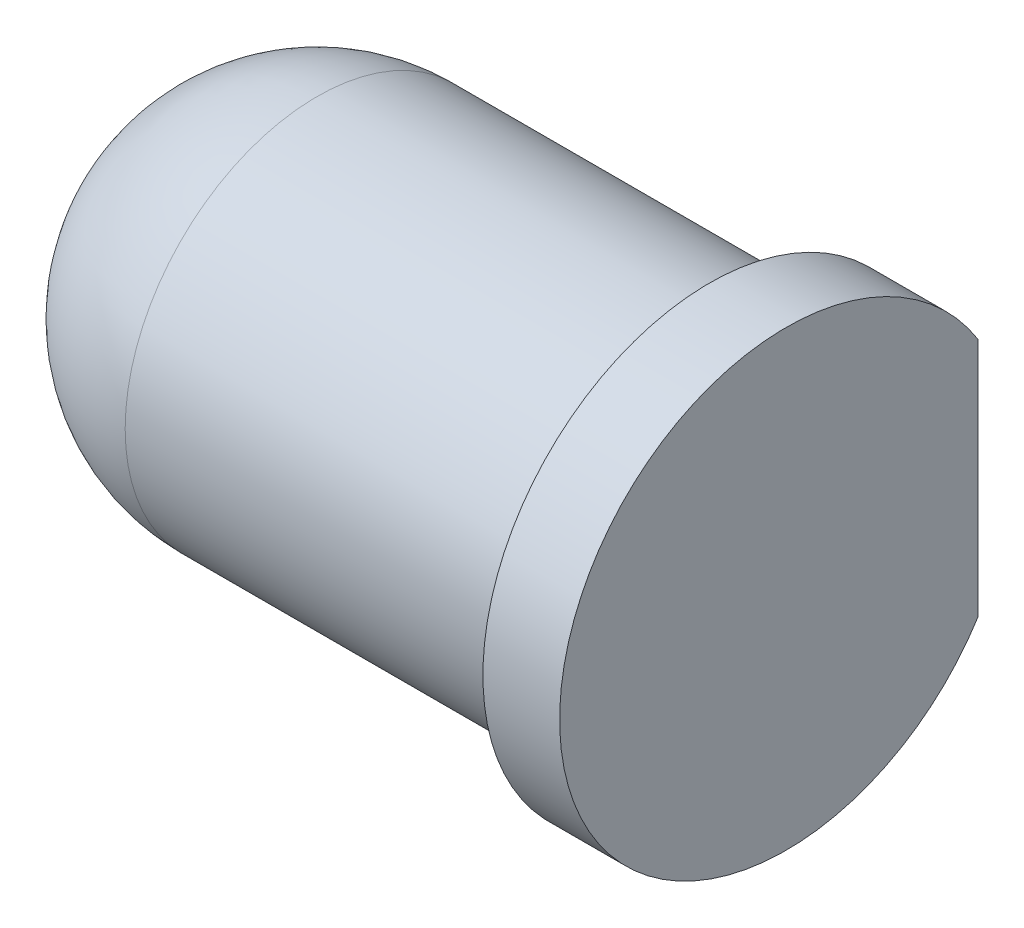
ISO-10303-21;
HEADER;
FILE_DESCRIPTION(('STEP AP214'),'2;1');
FILE_NAME('part.step','',(''),(''),'','','');
FILE_SCHEMA(('AUTOMOTIVE_DESIGN { 1 0 10303 214 1 1 1 1 }'));
ENDSEC;
DATA;
#1=APPLICATION_CONTEXT('core data for automotive mechanical design processes');
#2=APPLICATION_PROTOCOL_DEFINITION('international standard','automotive_design',2000,#1);
#3=PRODUCT_CONTEXT('',#1,'mechanical');
#4=PRODUCT('Part','Part','',(#3));
#5=PRODUCT_RELATED_PRODUCT_CATEGORY('part','',(#4));
#6=PRODUCT_DEFINITION_FORMATION('','',#4);
#7=PRODUCT_DEFINITION_CONTEXT('part definition',#1,'design');
#8=PRODUCT_DEFINITION('design','',#6,#7);
#9=PRODUCT_DEFINITION_SHAPE('','',#8);
#10=(LENGTH_UNIT() NAMED_UNIT(*) SI_UNIT(.MILLI.,.METRE.));
#11=(NAMED_UNIT(*) PLANE_ANGLE_UNIT() SI_UNIT($,.RADIAN.));
#12=(NAMED_UNIT(*) SI_UNIT($,.STERADIAN.) SOLID_ANGLE_UNIT());
#13=UNCERTAINTY_MEASURE_WITH_UNIT(LENGTH_MEASURE(1.E-05),#10,'distance_accuracy_value','');
#14=(GEOMETRIC_REPRESENTATION_CONTEXT(3) GLOBAL_UNCERTAINTY_ASSIGNED_CONTEXT((#13)) GLOBAL_UNIT_ASSIGNED_CONTEXT((#10,
#11,#12)) REPRESENTATION_CONTEXT('',''));
#15=CARTESIAN_POINT('',(0.,0.,0.));
#16=DIRECTION('',(0.,0.,1.));
#17=DIRECTION('',(1.,0.,0.));
#18=AXIS2_PLACEMENT_3D('',#15,#16,#17);
#19=CARTESIAN_POINT('',(3.8,0.,0.));
#20=DIRECTION('',(-1.,0.,0.));
#21=DIRECTION('',(0.,0.,1.));
#22=AXIS2_PLACEMENT_3D('',#19,#20,#21);
#23=CYLINDRICAL_SURFACE('',#22,2.5);
#24=CARTESIAN_POINT('',(-1.31,0.,0.));
#25=DIRECTION('',(-1.,0.,0.));
#26=DIRECTION('',(0.,0.,1.));
#27=AXIS2_PLACEMENT_3D('',#24,#25,#26);
#28=CIRCLE('',#27,2.5);
#29=CARTESIAN_POINT('',(-1.31,0.,2.5));
#30=VERTEX_POINT('',#29);
#31=EDGE_CURVE('E83',#30,#30,#28,.T.);
#32=ORIENTED_EDGE('',*,*,#31,.F.);
#33=EDGE_LOOP('',(#32));
#34=FACE_BOUND('',#33,.T.);
#35=CARTESIAN_POINT('',(3.8,0.,0.));
#36=DIRECTION('',(1.,0.,0.));
#37=DIRECTION('',(0.,0.,-1.));
#38=AXIS2_PLACEMENT_3D('',#35,#36,#37);
#39=CIRCLE('',#38,2.5);
#40=CARTESIAN_POINT('',(3.8,0.,-2.5));
#41=VERTEX_POINT('',#40);
#42=EDGE_CURVE('E39',#41,#41,#39,.T.);
#43=ORIENTED_EDGE('',*,*,#42,.F.);
#44=EDGE_LOOP('',(#43));
#45=FACE_BOUND('',#44,.T.);
#46=ADVANCED_FACE('F32',(#34,#45),#23,.T.);
#47=CARTESIAN_POINT('',(3.8,0.,0.));
#48=DIRECTION('',(1.,0.,0.));
#49=DIRECTION('',(0.,0.,-1.));
#50=AXIS2_PLACEMENT_3D('',#47,#48,#49);
#51=PLANE('',#50);
#52=CARTESIAN_POINT('',(3.8,0.,0.));
#53=DIRECTION('',(1.,0.,0.));
#54=DIRECTION('',(0.,0.,-1.));
#55=AXIS2_PLACEMENT_3D('',#52,#53,#54);
#56=CIRCLE('',#55,2.95);
#57=CARTESIAN_POINT('',(3.8,1.56604597633658,-2.5));
#58=VERTEX_POINT('',#57);
#59=CARTESIAN_POINT('',(3.8,-1.56604597633658,-2.5));
#60=VERTEX_POINT('',#59);
#61=EDGE_CURVE('E70',#58,#60,#56,.T.);
#62=ORIENTED_EDGE('',*,*,#61,.F.);
#63=DIRECTION('',(0.,1.,0.));
#64=VECTOR('',#63,1.);
#65=CARTESIAN_POINT('',(3.8,-4.03822364017969,-2.5));
#66=LINE('',#65,#64);
#67=EDGE_CURVE('E72',#41,#58,#66,.T.);
#68=ORIENTED_EDGE('',*,*,#67,.F.);
#69=ORIENTED_EDGE('',*,*,#42,.T.);
#70=EDGE_CURVE('E59',#60,#41,#66,.T.);
#71=ORIENTED_EDGE('',*,*,#70,.F.);
#72=EDGE_LOOP('',(#62,#68,#69,#71));
#73=FACE_BOUND('',#72,.T.);
#74=ADVANCED_FACE('F69',(#73),#51,.F.);
#75=CARTESIAN_POINT('',(4.8,0.,0.));
#76=DIRECTION('',(-1.,0.,0.));
#77=DIRECTION('',(0.,0.,1.));
#78=AXIS2_PLACEMENT_3D('',#75,#76,#77);
#79=CYLINDRICAL_SURFACE('',#78,2.95);
#80=CARTESIAN_POINT('',(4.8,0.,0.));
#81=DIRECTION('',(1.,0.,0.));
#82=DIRECTION('',(0.,0.,-1.));
#83=AXIS2_PLACEMENT_3D('',#80,#81,#82);
#84=CIRCLE('',#83,2.95);
#85=CARTESIAN_POINT('',(4.8,1.56604597633658,-2.5));
#86=VERTEX_POINT('',#85);
#87=CARTESIAN_POINT('',(4.8,-1.56604597633658,-2.5));
#88=VERTEX_POINT('',#87);
#89=EDGE_CURVE('E75',#86,#88,#84,.T.);
#90=ORIENTED_EDGE('',*,*,#89,.F.);
#91=DIRECTION('',(-1.,0.,0.));
#92=VECTOR('',#91,1.);
#93=CARTESIAN_POINT('',(4.8,1.56604597633658,-2.5));
#94=LINE('',#93,#92);
#95=EDGE_CURVE('E45',#86,#58,#94,.T.);
#96=ORIENTED_EDGE('',*,*,#95,.T.);
#97=ORIENTED_EDGE('',*,*,#61,.T.);
#98=DIRECTION('',(-1.,0.,0.));
#99=VECTOR('',#98,1.);
#100=CARTESIAN_POINT('',(4.8,-1.56604597633658,-2.5));
#101=LINE('',#100,#99);
#102=EDGE_CURVE('E56',#60,#88,#101,.F.);
#103=ORIENTED_EDGE('',*,*,#102,.T.);
#104=EDGE_LOOP('',(#90,#96,#97,#103));
#105=FACE_BOUND('',#104,.T.);
#106=ADVANCED_FACE('F74',(#105),#79,.T.);
#107=CARTESIAN_POINT('',(4.8,0.,0.));
#108=DIRECTION('',(1.,0.,0.));
#109=DIRECTION('',(0.,0.,-1.));
#110=AXIS2_PLACEMENT_3D('',#107,#108,#109);
#111=PLANE('',#110);
#112=DIRECTION('',(0.,-1.,0.));
#113=VECTOR('',#112,1.);
#114=CARTESIAN_POINT('',(4.8,0.,-2.5));
#115=LINE('',#114,#113);
#116=EDGE_CURVE('E11',#86,#88,#115,.T.);
#117=ORIENTED_EDGE('',*,*,#116,.F.);
#118=ORIENTED_EDGE('',*,*,#89,.T.);
#119=EDGE_LOOP('',(#117,#118));
#120=FACE_BOUND('',#119,.T.);
#121=ADVANCED_FACE('F99',(#120),#111,.T.);
#122=CARTESIAN_POINT('',(4.8,-4.03822364017969,-2.5));
#123=DIRECTION('',(0.,0.,1.));
#124=DIRECTION('',(1.,0.,0.));
#125=AXIS2_PLACEMENT_3D('',#122,#123,#124);
#126=PLANE('',#125);
#127=ORIENTED_EDGE('',*,*,#116,.T.);
#128=ORIENTED_EDGE('',*,*,#102,.F.);
#129=ORIENTED_EDGE('',*,*,#70,.T.);
#130=ORIENTED_EDGE('',*,*,#67,.T.);
#131=ORIENTED_EDGE('',*,*,#95,.F.);
#132=EDGE_LOOP('',(#127,#128,#129,#130,#131));
#133=FACE_BOUND('',#132,.T.);
#134=ADVANCED_FACE('F58',(#133),#126,.F.);
#135=CARTESIAN_POINT('',(-1.31,0.,0.));
#136=DIRECTION('',(-1.,0.,0.));
#137=DIRECTION('',(0.,0.,1.));
#138=AXIS2_PLACEMENT_3D('',#135,#136,#137);
#139=DEGENERATE_TOROIDAL_SURFACE('',#138,0.0100000000000008,2.49,.T.);
#140=ORIENTED_EDGE('',*,*,#31,.T.);
#141=EDGE_LOOP('',(#140));
#142=FACE_BOUND('',#141,.T.);
#143=CARTESIAN_POINT('',(-3.8,0.,0.));
#144=DIRECTION('',(-1.,0.,0.));
#145=DIRECTION('',(0.,0.,1.));
#146=AXIS2_PLACEMENT_3D('',#143,#144,#145);
#147=CIRCLE('',#146,0.0100000000000008);
#148=CARTESIAN_POINT('',(-3.8,0.,0.0100000000000005));
#149=VERTEX_POINT('',#148);
#150=EDGE_CURVE('E80',#149,#149,#147,.T.);
#151=ORIENTED_EDGE('',*,*,#150,.F.);
#152=EDGE_LOOP('',(#151));
#153=FACE_BOUND('',#152,.T.);
#154=ADVANCED_FACE('F87',(#142,#153),#139,.T.);
#155=CARTESIAN_POINT('',(-3.8,0.,0.));
#156=DIRECTION('',(1.,0.,0.));
#157=DIRECTION('',(0.,0.,-1.));
#158=AXIS2_PLACEMENT_3D('',#155,#156,#157);
#159=PLANE('',#158);
#160=ORIENTED_EDGE('',*,*,#150,.T.);
#161=EDGE_LOOP('',(#160));
#162=FACE_BOUND('',#161,.T.);
#163=ADVANCED_FACE('F103',(#162),#159,.F.);
#164=CLOSED_SHELL('',(#46,#74,#106,#121,#134,#154,#163));
#165=MANIFOLD_SOLID_BREP('B2',#164);
#166=ADVANCED_BREP_SHAPE_REPRESENTATION('',(#18,#165),#14);
#167=SHAPE_DEFINITION_REPRESENTATION(#9,#166);
ENDSEC;
END-ISO-10303-21;
